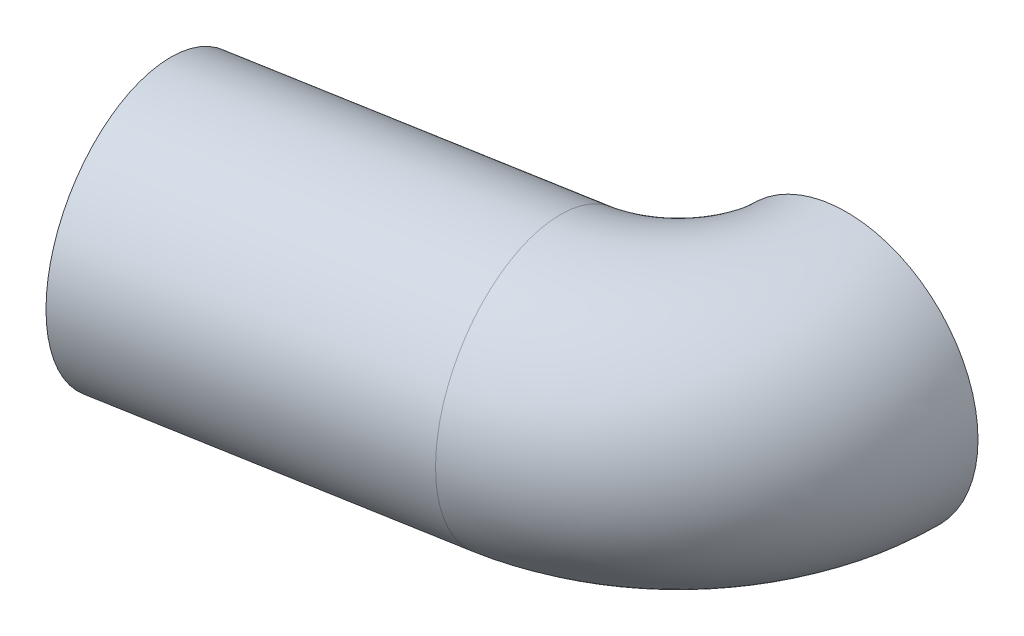
ISO-10303-21;
HEADER;
FILE_DESCRIPTION(('STEP AP214'),'2;1');
FILE_NAME('part.step','',(''),(''),'','','');
FILE_SCHEMA(('AUTOMOTIVE_DESIGN { 1 0 10303 214 1 1 1 1 }'));
ENDSEC;
DATA;
#1=APPLICATION_CONTEXT('core data for automotive mechanical design processes');
#2=APPLICATION_PROTOCOL_DEFINITION('international standard','automotive_design',2000,#1);
#3=PRODUCT_CONTEXT('',#1,'mechanical');
#4=PRODUCT('Part','Part','',(#3));
#5=PRODUCT_RELATED_PRODUCT_CATEGORY('part','',(#4));
#6=PRODUCT_DEFINITION_FORMATION('','',#4);
#7=PRODUCT_DEFINITION_CONTEXT('part definition',#1,'design');
#8=PRODUCT_DEFINITION('design','',#6,#7);
#9=PRODUCT_DEFINITION_SHAPE('','',#8);
#10=(LENGTH_UNIT() NAMED_UNIT(*) SI_UNIT(.MILLI.,.METRE.));
#11=(NAMED_UNIT(*) PLANE_ANGLE_UNIT() SI_UNIT($,.RADIAN.));
#12=(NAMED_UNIT(*) SI_UNIT($,.STERADIAN.) SOLID_ANGLE_UNIT());
#13=UNCERTAINTY_MEASURE_WITH_UNIT(LENGTH_MEASURE(1.E-05),#10,'distance_accuracy_value','');
#14=(GEOMETRIC_REPRESENTATION_CONTEXT(3) GLOBAL_UNCERTAINTY_ASSIGNED_CONTEXT((#13)) GLOBAL_UNIT_ASSIGNED_CONTEXT((#10,
#11,#12)) REPRESENTATION_CONTEXT('',''));
#15=CARTESIAN_POINT('',(0.,0.,0.));
#16=DIRECTION('',(0.,0.,1.));
#17=DIRECTION('',(1.,0.,0.));
#18=AXIS2_PLACEMENT_3D('',#15,#16,#17);
#19=CARTESIAN_POINT('',(-32.,0.,0.));
#20=DIRECTION('',(0.,1.,0.));
#21=DIRECTION('',(-1.,0.,0.));
#22=AXIS2_PLACEMENT_3D('',#19,#20,#21);
#23=TOROIDAL_SURFACE('',#22,32.,22.5);
#24=CARTESIAN_POINT('',(-26.4432583146583,0.,31.5138480963907));
#25=DIRECTION('',(-0.984807753012209,0.,0.173648177666927));
#26=DIRECTION('',(0.173648177666927,0.,0.984807753012209));
#27=AXIS2_PLACEMENT_3D('',#24,#25,#26);
#28=CIRCLE('',#27,22.5);
#29=CARTESIAN_POINT('',(-22.5361743171525,0.,53.6720225391654));
#30=VERTEX_POINT('',#29);
#31=EDGE_CURVE('E54',#30,#30,#28,.T.);
#32=CARTESIAN_POINT('',(0.,0.,0.));
#33=DIRECTION('',(0.,0.,1.));
#34=DIRECTION('',(1.,0.,0.));
#35=AXIS2_PLACEMENT_3D('',#32,#33,#34);
#36=CIRCLE('',#35,22.5);
#37=CARTESIAN_POINT('',(22.5,0.,0.));
#38=VERTEX_POINT('',#37);
#39=EDGE_CURVE('E44',#38,#38,#36,.T.);
#40=CARTESIAN_POINT('',(-32.,0.,0.));
#41=DIRECTION('',(0.,1.,0.));
#42=DIRECTION('',(-1.,0.,0.));
#43=AXIS2_PLACEMENT_3D('',#40,#41,#42);
#44=CIRCLE('',#43,54.5);
#45=EDGE_CURVE('',#30,#38,#44,.T.);
#46=ORIENTED_EDGE('',*,*,#31,.T.);
#47=ORIENTED_EDGE('',*,*,#39,.F.);
#48=ORIENTED_EDGE('',*,*,#45,.T.);
#49=ORIENTED_EDGE('',*,*,#45,.F.);
#50=EDGE_LOOP('',(#46,#48,#47,#49));
#51=FACE_BOUND('',#50,.T.);
#52=ADVANCED_FACE('F33',(#51),#23,.F.);
#53=CARTESIAN_POINT('',(-32.,0.,0.));
#54=DIRECTION('',(0.,1.,0.));
#55=DIRECTION('',(-1.,0.,0.));
#56=AXIS2_PLACEMENT_3D('',#53,#54,#55);
#57=TOROIDAL_SURFACE('',#56,32.,25.);
#58=CARTESIAN_POINT('',(-26.4432583146583,0.,31.5138480963907));
#59=DIRECTION('',(-0.984807753012209,0.,0.173648177666927));
#60=DIRECTION('',(0.173648177666927,0.,0.984807753012209));
#61=AXIS2_PLACEMENT_3D('',#58,#59,#60);
#62=CIRCLE('',#61,25.);
#63=CARTESIAN_POINT('',(-22.1020538729851,0.,56.1340419216959));
#64=VERTEX_POINT('',#63);
#65=EDGE_CURVE('E10',#64,#64,#62,.T.);
#66=CARTESIAN_POINT('',(0.,0.,0.));
#67=DIRECTION('',(0.,0.,1.));
#68=DIRECTION('',(1.,0.,0.));
#69=AXIS2_PLACEMENT_3D('',#66,#67,#68);
#70=CIRCLE('',#69,25.);
#71=CARTESIAN_POINT('',(25.,0.,0.));
#72=VERTEX_POINT('',#71);
#73=EDGE_CURVE('E40',#72,#72,#70,.T.);
#74=CARTESIAN_POINT('',(-32.,0.,0.));
#75=DIRECTION('',(0.,1.,0.));
#76=DIRECTION('',(-1.,0.,0.));
#77=AXIS2_PLACEMENT_3D('',#74,#75,#76);
#78=CIRCLE('',#77,57.);
#79=EDGE_CURVE('',#64,#72,#78,.T.);
#80=ORIENTED_EDGE('',*,*,#65,.F.);
#81=ORIENTED_EDGE('',*,*,#73,.T.);
#82=ORIENTED_EDGE('',*,*,#79,.T.);
#83=ORIENTED_EDGE('',*,*,#79,.F.);
#84=EDGE_LOOP('',(#80,#82,#81,#83));
#85=FACE_BOUND('',#84,.T.);
#86=ADVANCED_FACE('F35',(#85),#57,.T.);
#87=CARTESIAN_POINT('',(0.,0.,0.));
#88=DIRECTION('',(0.,0.,1.));
#89=DIRECTION('',(1.,0.,0.));
#90=AXIS2_PLACEMENT_3D('',#87,#88,#89);
#91=PLANE('',#90);
#92=ORIENTED_EDGE('',*,*,#39,.T.);
#93=EDGE_LOOP('',(#92));
#94=FACE_BOUND('',#93,.T.);
#95=ORIENTED_EDGE('',*,*,#73,.F.);
#96=EDGE_LOOP('',(#95));
#97=FACE_BOUND('',#96,.T.);
#98=ADVANCED_FACE('F66',(#94,#97),#91,.F.);
#99=CARTESIAN_POINT('',(-89.4709545074397,0.,42.627331467074));
#100=DIRECTION('',(-0.984807753012209,0.,0.173648177666927));
#101=DIRECTION('',(0.173648177666927,0.,0.984807753012209));
#102=AXIS2_PLACEMENT_3D('',#99,#100,#101);
#103=PLANE('',#102);
#104=CARTESIAN_POINT('',(-89.4709545074397,0.,42.627331467074));
#105=DIRECTION('',(-0.984807753012209,0.,0.173648177666927));
#106=DIRECTION('',(0.173648177666927,0.,0.984807753012209));
#107=AXIS2_PLACEMENT_3D('',#104,#105,#106);
#108=CIRCLE('',#107,25.);
#109=CARTESIAN_POINT('',(-85.1297500657665,0.,67.2475252923793));
#110=VERTEX_POINT('',#109);
#111=EDGE_CURVE('E48',#110,#110,#108,.T.);
#112=ORIENTED_EDGE('',*,*,#111,.T.);
#113=EDGE_LOOP('',(#112));
#114=FACE_BOUND('',#113,.T.);
#115=CARTESIAN_POINT('',(-89.4709545074397,0.,42.627331467074));
#116=DIRECTION('',(-0.984807753012209,0.,0.173648177666927));
#117=DIRECTION('',(0.173648177666927,0.,0.984807753012209));
#118=AXIS2_PLACEMENT_3D('',#115,#116,#117);
#119=CIRCLE('',#118,22.5);
#120=CARTESIAN_POINT('',(-85.5638705099338,0.,64.7855059098488));
#121=VERTEX_POINT('',#120);
#122=EDGE_CURVE('E53',#121,#121,#119,.T.);
#123=ORIENTED_EDGE('',*,*,#122,.F.);
#124=EDGE_LOOP('',(#123));
#125=FACE_BOUND('',#124,.T.);
#126=ADVANCED_FACE('F63',(#114,#125),#103,.T.);
#127=CARTESIAN_POINT('',(-89.4709545074397,0.,42.627331467074));
#128=DIRECTION('',(0.984807753012209,0.,-0.173648177666927));
#129=DIRECTION('',(-0.173648177666927,0.,-0.984807753012209));
#130=AXIS2_PLACEMENT_3D('',#127,#128,#129);
#131=CYLINDRICAL_SURFACE('',#130,25.);
#132=ORIENTED_EDGE('',*,*,#111,.F.);
#133=EDGE_LOOP('',(#132));
#134=FACE_BOUND('',#133,.T.);
#135=ORIENTED_EDGE('',*,*,#65,.T.);
#136=EDGE_LOOP('',(#135));
#137=FACE_BOUND('',#136,.T.);
#138=ADVANCED_FACE('F65',(#134,#137),#131,.T.);
#139=CARTESIAN_POINT('',(-89.4709545074397,0.,42.627331467074));
#140=DIRECTION('',(0.984807753012209,0.,-0.173648177666927));
#141=DIRECTION('',(-0.173648177666927,0.,-0.984807753012209));
#142=AXIS2_PLACEMENT_3D('',#139,#140,#141);
#143=CYLINDRICAL_SURFACE('',#142,22.5);
#144=ORIENTED_EDGE('',*,*,#122,.T.);
#145=EDGE_LOOP('',(#144));
#146=FACE_BOUND('',#145,.T.);
#147=ORIENTED_EDGE('',*,*,#31,.F.);
#148=EDGE_LOOP('',(#147));
#149=FACE_BOUND('',#148,.T.);
#150=ADVANCED_FACE('F60',(#146,#149),#143,.F.);
#151=CLOSED_SHELL('',(#52,#86,#98,#126,#138,#150));
#152=MANIFOLD_SOLID_BREP('B2',#151);
#153=ADVANCED_BREP_SHAPE_REPRESENTATION('',(#18,#152),#14);
#154=SHAPE_DEFINITION_REPRESENTATION(#9,#153);
ENDSEC;
END-ISO-10303-21;
